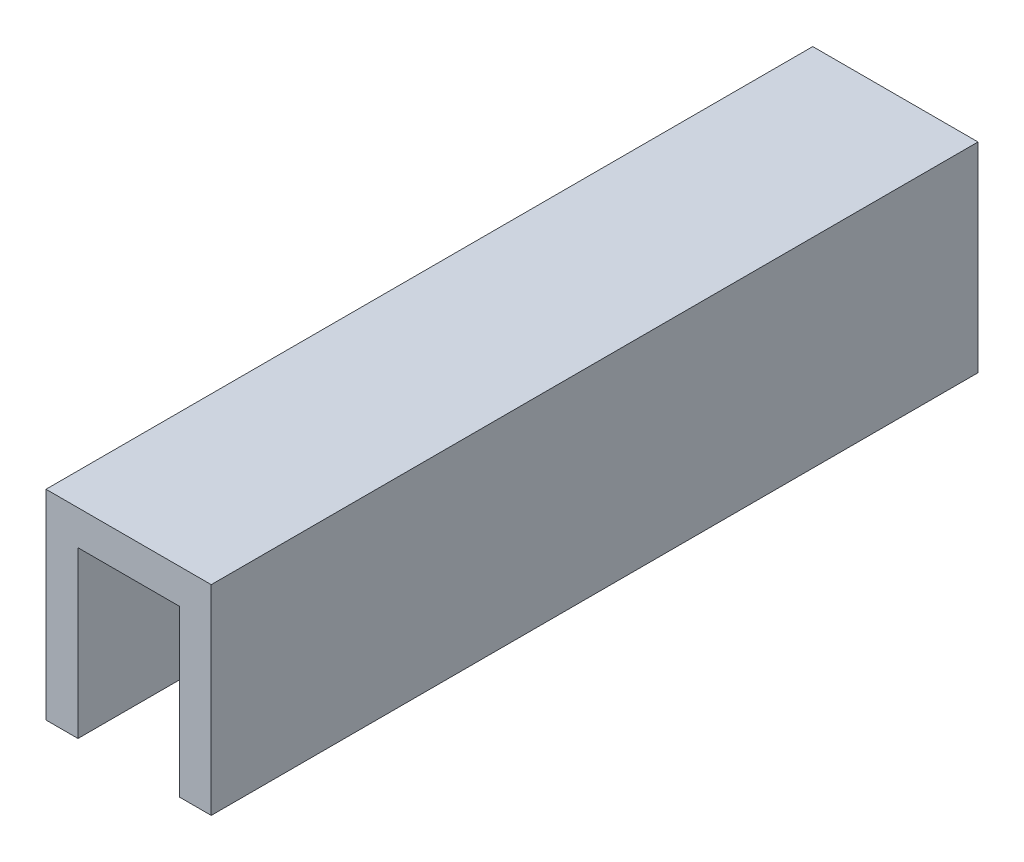
ISO-10303-21;
HEADER;
FILE_DESCRIPTION(('STEP AP214'),'2;1');
FILE_NAME('part.step','',(''),(''),'','','');
FILE_SCHEMA(('AUTOMOTIVE_DESIGN { 1 0 10303 214 1 1 1 1 }'));
ENDSEC;
DATA;
#1=APPLICATION_CONTEXT('core data for automotive mechanical design processes');
#2=APPLICATION_PROTOCOL_DEFINITION('international standard','automotive_design',2000,#1);
#3=PRODUCT_CONTEXT('',#1,'mechanical');
#4=PRODUCT('Part','Part','',(#3));
#5=PRODUCT_RELATED_PRODUCT_CATEGORY('part','',(#4));
#6=PRODUCT_DEFINITION_FORMATION('','',#4);
#7=PRODUCT_DEFINITION_CONTEXT('part definition',#1,'design');
#8=PRODUCT_DEFINITION('design','',#6,#7);
#9=PRODUCT_DEFINITION_SHAPE('','',#8);
#10=(LENGTH_UNIT() NAMED_UNIT(*) SI_UNIT(.MILLI.,.METRE.));
#11=(NAMED_UNIT(*) PLANE_ANGLE_UNIT() SI_UNIT($,.RADIAN.));
#12=(NAMED_UNIT(*) SI_UNIT($,.STERADIAN.) SOLID_ANGLE_UNIT());
#13=UNCERTAINTY_MEASURE_WITH_UNIT(LENGTH_MEASURE(1.E-05),#10,'distance_accuracy_value','');
#14=(GEOMETRIC_REPRESENTATION_CONTEXT(3) GLOBAL_UNCERTAINTY_ASSIGNED_CONTEXT((#13)) GLOBAL_UNIT_ASSIGNED_CONTEXT((#10,
#11,#12)) REPRESENTATION_CONTEXT('',''));
#15=CARTESIAN_POINT('',(0.,0.,0.));
#16=DIRECTION('',(0.,0.,1.));
#17=DIRECTION('',(1.,0.,0.));
#18=AXIS2_PLACEMENT_3D('',#15,#16,#17);
#19=CARTESIAN_POINT('',(0.,0.,0.));
#20=DIRECTION('',(0.,0.,-1.));
#21=DIRECTION('',(-1.,0.,0.));
#22=AXIS2_PLACEMENT_3D('',#19,#20,#21);
#23=PLANE('',#22);
#24=DIRECTION('',(0.,1.,0.));
#25=VECTOR('',#24,1.);
#26=CARTESIAN_POINT('',(0.,-7.874,0.));
#27=LINE('',#26,#25);
#28=CARTESIAN_POINT('',(0.,-7.874,0.));
#29=VERTEX_POINT('',#28);
#30=CARTESIAN_POINT('',(0.,0.,0.));
#31=VERTEX_POINT('',#30);
#32=EDGE_CURVE('E111',#29,#31,#27,.T.);
#33=ORIENTED_EDGE('',*,*,#32,.F.);
#34=DIRECTION('',(1.,0.,0.));
#35=VECTOR('',#34,1.);
#36=CARTESIAN_POINT('',(-1.524,-7.874,0.));
#37=LINE('',#36,#35);
#38=CARTESIAN_POINT('',(-1.524,-7.874,0.));
#39=VERTEX_POINT('',#38);
#40=EDGE_CURVE('E75',#39,#29,#37,.T.);
#41=ORIENTED_EDGE('',*,*,#40,.F.);
#42=DIRECTION('',(0.,-1.,0.));
#43=VECTOR('',#42,1.);
#44=CARTESIAN_POINT('',(-1.524,1.651,0.));
#45=LINE('',#44,#43);
#46=CARTESIAN_POINT('',(-1.524,1.651,0.));
#47=VERTEX_POINT('',#46);
#48=EDGE_CURVE('E81',#47,#39,#45,.T.);
#49=ORIENTED_EDGE('',*,*,#48,.F.);
#50=DIRECTION('',(-1.,0.,0.));
#51=VECTOR('',#50,1.);
#52=CARTESIAN_POINT('',(-1.524,1.651,0.));
#53=LINE('',#52,#51);
#54=CARTESIAN_POINT('',(6.35,1.651,0.));
#55=VERTEX_POINT('',#54);
#56=EDGE_CURVE('E86',#55,#47,#53,.T.);
#57=ORIENTED_EDGE('',*,*,#56,.F.);
#58=DIRECTION('',(0.,1.,0.));
#59=VECTOR('',#58,1.);
#60=CARTESIAN_POINT('',(6.35,-7.874,0.));
#61=LINE('',#60,#59);
#62=CARTESIAN_POINT('',(6.35,-7.874,0.));
#63=VERTEX_POINT('',#62);
#64=EDGE_CURVE('E162',#63,#55,#61,.T.);
#65=ORIENTED_EDGE('',*,*,#64,.F.);
#66=DIRECTION('',(1.,0.,0.));
#67=VECTOR('',#66,1.);
#68=CARTESIAN_POINT('',(4.826,-7.874,0.));
#69=LINE('',#68,#67);
#70=CARTESIAN_POINT('',(4.826,-7.874,0.));
#71=VERTEX_POINT('',#70);
#72=EDGE_CURVE('E151',#71,#63,#69,.T.);
#73=ORIENTED_EDGE('',*,*,#72,.F.);
#74=DIRECTION('',(0.,-1.,0.));
#75=VECTOR('',#74,1.);
#76=CARTESIAN_POINT('',(4.826,0.,0.));
#77=LINE('',#76,#75);
#78=CARTESIAN_POINT('',(4.826,0.,0.));
#79=VERTEX_POINT('',#78);
#80=EDGE_CURVE('E139',#79,#71,#77,.T.);
#81=ORIENTED_EDGE('',*,*,#80,.F.);
#82=DIRECTION('',(1.,0.,0.));
#83=VECTOR('',#82,1.);
#84=CARTESIAN_POINT('',(0.,0.,0.));
#85=LINE('',#84,#83);
#86=EDGE_CURVE('E113',#31,#79,#85,.T.);
#87=ORIENTED_EDGE('',*,*,#86,.F.);
#88=EDGE_LOOP('',(#33,#41,#49,#57,#65,#73,#81,#87));
#89=FACE_BOUND('',#88,.T.);
#90=ADVANCED_FACE('F43',(#89),#23,.T.);
#91=CARTESIAN_POINT('',(0.,0.,36.5379));
#92=DIRECTION('',(0.,0.,-1.));
#93=DIRECTION('',(-1.,0.,0.));
#94=AXIS2_PLACEMENT_3D('',#91,#92,#93);
#95=PLANE('',#94);
#96=DIRECTION('',(0.,1.,0.));
#97=VECTOR('',#96,1.);
#98=CARTESIAN_POINT('',(0.,-7.874,36.5379));
#99=LINE('',#98,#97);
#100=CARTESIAN_POINT('',(0.,-7.874,36.5379));
#101=VERTEX_POINT('',#100);
#102=CARTESIAN_POINT('',(0.,0.,36.5379));
#103=VERTEX_POINT('',#102);
#104=EDGE_CURVE('E129',#101,#103,#99,.T.);
#105=ORIENTED_EDGE('',*,*,#104,.T.);
#106=DIRECTION('',(1.,0.,0.));
#107=VECTOR('',#106,1.);
#108=CARTESIAN_POINT('',(0.,0.,36.5379));
#109=LINE('',#108,#107);
#110=CARTESIAN_POINT('',(4.826,0.,36.5379));
#111=VERTEX_POINT('',#110);
#112=EDGE_CURVE('E140',#103,#111,#109,.T.);
#113=ORIENTED_EDGE('',*,*,#112,.T.);
#114=DIRECTION('',(0.,-1.,0.));
#115=VECTOR('',#114,1.);
#116=CARTESIAN_POINT('',(4.826,0.,36.5379));
#117=LINE('',#116,#115);
#118=CARTESIAN_POINT('',(4.826,-7.874,36.5379));
#119=VERTEX_POINT('',#118);
#120=EDGE_CURVE('E147',#111,#119,#117,.T.);
#121=ORIENTED_EDGE('',*,*,#120,.T.);
#122=DIRECTION('',(1.,0.,0.));
#123=VECTOR('',#122,1.);
#124=CARTESIAN_POINT('',(4.826,-7.874,36.5379));
#125=LINE('',#124,#123);
#126=CARTESIAN_POINT('',(6.35,-7.874,36.5379));
#127=VERTEX_POINT('',#126);
#128=EDGE_CURVE('E158',#119,#127,#125,.T.);
#129=ORIENTED_EDGE('',*,*,#128,.T.);
#130=DIRECTION('',(0.,1.,0.));
#131=VECTOR('',#130,1.);
#132=CARTESIAN_POINT('',(6.35,-7.874,36.5379));
#133=LINE('',#132,#131);
#134=CARTESIAN_POINT('',(6.35,1.651,36.5379));
#135=VERTEX_POINT('',#134);
#136=EDGE_CURVE('E169',#127,#135,#133,.T.);
#137=ORIENTED_EDGE('',*,*,#136,.T.);
#138=DIRECTION('',(-1.,0.,0.));
#139=VECTOR('',#138,1.);
#140=CARTESIAN_POINT('',(-1.524,1.651,36.5379));
#141=LINE('',#140,#139);
#142=CARTESIAN_POINT('',(-1.524,1.651,36.5379));
#143=VERTEX_POINT('',#142);
#144=EDGE_CURVE('E63',#135,#143,#141,.T.);
#145=ORIENTED_EDGE('',*,*,#144,.T.);
#146=DIRECTION('',(0.,-1.,0.));
#147=VECTOR('',#146,1.);
#148=CARTESIAN_POINT('',(-1.524,1.651,36.5379));
#149=LINE('',#148,#147);
#150=CARTESIAN_POINT('',(-1.524,-7.874,36.5379));
#151=VERTEX_POINT('',#150);
#152=EDGE_CURVE('E57',#143,#151,#149,.T.);
#153=ORIENTED_EDGE('',*,*,#152,.T.);
#154=DIRECTION('',(1.,0.,0.));
#155=VECTOR('',#154,1.);
#156=CARTESIAN_POINT('',(-1.524,-7.874,36.5379));
#157=LINE('',#156,#155);
#158=EDGE_CURVE('E11',#151,#101,#157,.T.);
#159=ORIENTED_EDGE('',*,*,#158,.T.);
#160=EDGE_LOOP('',(#105,#113,#121,#129,#137,#145,#153,#159));
#161=FACE_BOUND('',#160,.T.);
#162=ADVANCED_FACE('F213',(#161),#95,.F.);
#163=CARTESIAN_POINT('',(0.,-7.874,0.));
#164=DIRECTION('',(1.,0.,0.));
#165=DIRECTION('',(0.,0.,-1.));
#166=AXIS2_PLACEMENT_3D('',#163,#164,#165);
#167=PLANE('',#166);
#168=DIRECTION('',(0.,0.,1.));
#169=VECTOR('',#168,1.);
#170=CARTESIAN_POINT('',(0.,0.,0.));
#171=LINE('',#170,#169);
#172=EDGE_CURVE('E133',#31,#103,#171,.T.);
#173=ORIENTED_EDGE('',*,*,#172,.T.);
#174=ORIENTED_EDGE('',*,*,#104,.F.);
#175=DIRECTION('',(0.,0.,1.));
#176=VECTOR('',#175,1.);
#177=CARTESIAN_POINT('',(0.,-7.874,0.));
#178=LINE('',#177,#176);
#179=EDGE_CURVE('E124',#29,#101,#178,.T.);
#180=ORIENTED_EDGE('',*,*,#179,.F.);
#181=ORIENTED_EDGE('',*,*,#32,.T.);
#182=EDGE_LOOP('',(#173,#174,#180,#181));
#183=FACE_BOUND('',#182,.T.);
#184=ADVANCED_FACE('F128',(#183),#167,.T.);
#185=CARTESIAN_POINT('',(0.,0.,0.));
#186=DIRECTION('',(0.,-1.,0.));
#187=DIRECTION('',(0.,0.,-1.));
#188=AXIS2_PLACEMENT_3D('',#185,#186,#187);
#189=PLANE('',#188);
#190=DIRECTION('',(0.,0.,1.));
#191=VECTOR('',#190,1.);
#192=CARTESIAN_POINT('',(4.826,0.,0.));
#193=LINE('',#192,#191);
#194=EDGE_CURVE('E143',#79,#111,#193,.T.);
#195=ORIENTED_EDGE('',*,*,#194,.T.);
#196=ORIENTED_EDGE('',*,*,#112,.F.);
#197=ORIENTED_EDGE('',*,*,#172,.F.);
#198=ORIENTED_EDGE('',*,*,#86,.T.);
#199=EDGE_LOOP('',(#195,#196,#197,#198));
#200=FACE_BOUND('',#199,.T.);
#201=ADVANCED_FACE('F210',(#200),#189,.T.);
#202=CARTESIAN_POINT('',(4.826,0.,0.));
#203=DIRECTION('',(-1.,0.,0.));
#204=DIRECTION('',(0.,-1.,0.));
#205=AXIS2_PLACEMENT_3D('',#202,#203,#204);
#206=PLANE('',#205);
#207=DIRECTION('',(0.,0.,1.));
#208=VECTOR('',#207,1.);
#209=CARTESIAN_POINT('',(4.826,-7.874,0.));
#210=LINE('',#209,#208);
#211=EDGE_CURVE('E154',#71,#119,#210,.T.);
#212=ORIENTED_EDGE('',*,*,#211,.T.);
#213=ORIENTED_EDGE('',*,*,#120,.F.);
#214=ORIENTED_EDGE('',*,*,#194,.F.);
#215=ORIENTED_EDGE('',*,*,#80,.T.);
#216=EDGE_LOOP('',(#212,#213,#214,#215));
#217=FACE_BOUND('',#216,.T.);
#218=ADVANCED_FACE('F207',(#217),#206,.T.);
#219=CARTESIAN_POINT('',(4.826,-7.874,0.));
#220=DIRECTION('',(0.,-1.,0.));
#221=DIRECTION('',(0.,0.,-1.));
#222=AXIS2_PLACEMENT_3D('',#219,#220,#221);
#223=PLANE('',#222);
#224=DIRECTION('',(0.,0.,1.));
#225=VECTOR('',#224,1.);
#226=CARTESIAN_POINT('',(6.35,-7.874,0.));
#227=LINE('',#226,#225);
#228=EDGE_CURVE('E165',#63,#127,#227,.T.);
#229=ORIENTED_EDGE('',*,*,#228,.T.);
#230=ORIENTED_EDGE('',*,*,#128,.F.);
#231=ORIENTED_EDGE('',*,*,#211,.F.);
#232=ORIENTED_EDGE('',*,*,#72,.T.);
#233=EDGE_LOOP('',(#229,#230,#231,#232));
#234=FACE_BOUND('',#233,.T.);
#235=ADVANCED_FACE('F203',(#234),#223,.T.);
#236=CARTESIAN_POINT('',(6.35,-7.874,0.));
#237=DIRECTION('',(1.,0.,0.));
#238=DIRECTION('',(0.,0.,-1.));
#239=AXIS2_PLACEMENT_3D('',#236,#237,#238);
#240=PLANE('',#239);
#241=DIRECTION('',(0.,0.,1.));
#242=VECTOR('',#241,1.);
#243=CARTESIAN_POINT('',(6.35,1.651,0.));
#244=LINE('',#243,#242);
#245=EDGE_CURVE('E174',#55,#135,#244,.T.);
#246=ORIENTED_EDGE('',*,*,#245,.T.);
#247=ORIENTED_EDGE('',*,*,#136,.F.);
#248=ORIENTED_EDGE('',*,*,#228,.F.);
#249=ORIENTED_EDGE('',*,*,#64,.T.);
#250=EDGE_LOOP('',(#246,#247,#248,#249));
#251=FACE_BOUND('',#250,.T.);
#252=ADVANCED_FACE('F199',(#251),#240,.T.);
#253=CARTESIAN_POINT('',(-1.524,1.651,0.));
#254=DIRECTION('',(0.,1.,0.));
#255=DIRECTION('',(0.,0.,1.));
#256=AXIS2_PLACEMENT_3D('',#253,#254,#255);
#257=PLANE('',#256);
#258=DIRECTION('',(0.,0.,1.));
#259=VECTOR('',#258,1.);
#260=CARTESIAN_POINT('',(-1.524,1.651,0.));
#261=LINE('',#260,#259);
#262=EDGE_CURVE('E182',#47,#143,#261,.T.);
#263=ORIENTED_EDGE('',*,*,#262,.T.);
#264=ORIENTED_EDGE('',*,*,#144,.F.);
#265=ORIENTED_EDGE('',*,*,#245,.F.);
#266=ORIENTED_EDGE('',*,*,#56,.T.);
#267=EDGE_LOOP('',(#263,#264,#265,#266));
#268=FACE_BOUND('',#267,.T.);
#269=ADVANCED_FACE('F195',(#268),#257,.T.);
#270=CARTESIAN_POINT('',(-1.524,1.651,0.));
#271=DIRECTION('',(-1.,0.,0.));
#272=DIRECTION('',(0.,-1.,0.));
#273=AXIS2_PLACEMENT_3D('',#270,#271,#272);
#274=PLANE('',#273);
#275=DIRECTION('',(0.,0.,1.));
#276=VECTOR('',#275,1.);
#277=CARTESIAN_POINT('',(-1.524,-7.874,0.));
#278=LINE('',#277,#276);
#279=EDGE_CURVE('E51',#39,#151,#278,.T.);
#280=ORIENTED_EDGE('',*,*,#279,.T.);
#281=ORIENTED_EDGE('',*,*,#152,.F.);
#282=ORIENTED_EDGE('',*,*,#262,.F.);
#283=ORIENTED_EDGE('',*,*,#48,.T.);
#284=EDGE_LOOP('',(#280,#281,#282,#283));
#285=FACE_BOUND('',#284,.T.);
#286=ADVANCED_FACE('F192',(#285),#274,.T.);
#287=CARTESIAN_POINT('',(-1.524,-7.874,0.));
#288=DIRECTION('',(0.,-1.,0.));
#289=DIRECTION('',(0.,0.,-1.));
#290=AXIS2_PLACEMENT_3D('',#287,#288,#289);
#291=PLANE('',#290);
#292=ORIENTED_EDGE('',*,*,#158,.F.);
#293=ORIENTED_EDGE('',*,*,#279,.F.);
#294=ORIENTED_EDGE('',*,*,#40,.T.);
#295=ORIENTED_EDGE('',*,*,#179,.T.);
#296=EDGE_LOOP('',(#292,#293,#294,#295));
#297=FACE_BOUND('',#296,.T.);
#298=ADVANCED_FACE('F123',(#297),#291,.T.);
#299=CLOSED_SHELL('',(#90,#162,#184,#201,#218,#235,#252,#269,#286,#298));
#300=MANIFOLD_SOLID_BREP('B2',#299);
#301=ADVANCED_BREP_SHAPE_REPRESENTATION('',(#18,#300),#14);
#302=SHAPE_DEFINITION_REPRESENTATION(#9,#301);
ENDSEC;
END-ISO-10303-21;
